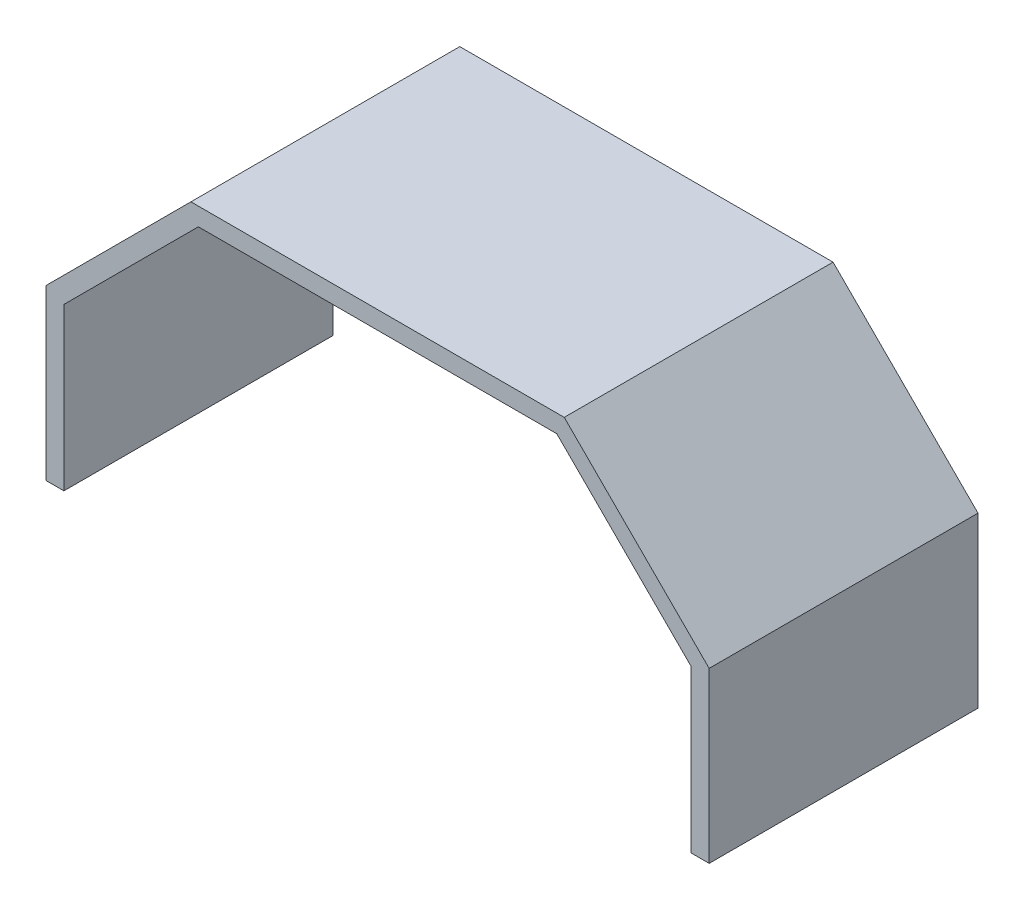
ISO-10303-21;
HEADER;
FILE_DESCRIPTION(('STEP AP214'),'2;1');
FILE_NAME('part.step','',(''),(''),'','','');
FILE_SCHEMA(('AUTOMOTIVE_DESIGN { 1 0 10303 214 1 1 1 1 }'));
ENDSEC;
DATA;
#1=APPLICATION_CONTEXT('core data for automotive mechanical design processes');
#2=APPLICATION_PROTOCOL_DEFINITION('international standard','automotive_design',2000,#1);
#3=PRODUCT_CONTEXT('',#1,'mechanical');
#4=PRODUCT('Part','Part','',(#3));
#5=PRODUCT_RELATED_PRODUCT_CATEGORY('part','',(#4));
#6=PRODUCT_DEFINITION_FORMATION('','',#4);
#7=PRODUCT_DEFINITION_CONTEXT('part definition',#1,'design');
#8=PRODUCT_DEFINITION('design','',#6,#7);
#9=PRODUCT_DEFINITION_SHAPE('','',#8);
#10=(LENGTH_UNIT() NAMED_UNIT(*) SI_UNIT(.MILLI.,.METRE.));
#11=(NAMED_UNIT(*) PLANE_ANGLE_UNIT() SI_UNIT($,.RADIAN.));
#12=(NAMED_UNIT(*) SI_UNIT($,.STERADIAN.) SOLID_ANGLE_UNIT());
#13=UNCERTAINTY_MEASURE_WITH_UNIT(LENGTH_MEASURE(1.E-05),#10,'distance_accuracy_value','');
#14=(GEOMETRIC_REPRESENTATION_CONTEXT(3) GLOBAL_UNCERTAINTY_ASSIGNED_CONTEXT((#13)) GLOBAL_UNIT_ASSIGNED_CONTEXT((#10,
#11,#12)) REPRESENTATION_CONTEXT('',''));
#15=CARTESIAN_POINT('',(0.,0.,0.));
#16=DIRECTION('',(0.,0.,1.));
#17=DIRECTION('',(1.,0.,0.));
#18=AXIS2_PLACEMENT_3D('',#15,#16,#17);
#19=CARTESIAN_POINT('',(37.,32.4152093182311,30.));
#20=DIRECTION('',(-1.,0.,0.));
#21=DIRECTION('',(0.,0.,1.));
#22=AXIS2_PLACEMENT_3D('',#19,#20,#21);
#23=PLANE('',#22);
#24=DIRECTION('',(0.,1.,0.));
#25=VECTOR('',#24,1.);
#26=CARTESIAN_POINT('',(37.,32.4152093182311,0.));
#27=LINE('',#26,#25);
#28=CARTESIAN_POINT('',(37.,13.5658743437964,0.));
#29=VERTEX_POINT('',#28);
#30=CARTESIAN_POINT('',(37.,32.4152093182311,0.));
#31=VERTEX_POINT('',#30);
#32=EDGE_CURVE('E157',#29,#31,#27,.T.);
#33=ORIENTED_EDGE('',*,*,#32,.T.);
#34=DIRECTION('',(0.,0.,-1.));
#35=VECTOR('',#34,1.);
#36=CARTESIAN_POINT('',(37.,32.4152093182311,30.));
#37=LINE('',#36,#35);
#38=CARTESIAN_POINT('',(37.,32.4152093182311,30.));
#39=VERTEX_POINT('',#38);
#40=EDGE_CURVE('E11',#39,#31,#37,.T.);
#41=ORIENTED_EDGE('',*,*,#40,.F.);
#42=DIRECTION('',(0.,1.,0.));
#43=VECTOR('',#42,1.);
#44=CARTESIAN_POINT('',(37.,32.4152093182311,30.));
#45=LINE('',#44,#43);
#46=CARTESIAN_POINT('',(37.,13.5658743437964,30.));
#47=VERTEX_POINT('',#46);
#48=EDGE_CURVE('E179',#47,#39,#45,.T.);
#49=ORIENTED_EDGE('',*,*,#48,.F.);
#50=DIRECTION('',(0.,0.,-1.));
#51=VECTOR('',#50,1.);
#52=CARTESIAN_POINT('',(37.,13.5658743437964,30.));
#53=LINE('',#52,#51);
#54=EDGE_CURVE('E153',#47,#29,#53,.T.);
#55=ORIENTED_EDGE('',*,*,#54,.T.);
#56=EDGE_LOOP('',(#33,#41,#49,#55));
#57=FACE_BOUND('',#56,.T.);
#58=ADVANCED_FACE('F37',(#57),#23,.F.);
#59=CARTESIAN_POINT('',(20.8284271247462,48.5867821934849,30.));
#60=DIRECTION('',(-0.707106781186548,-0.707106781186547,0.));
#61=DIRECTION('',(0.707106781186547,-0.707106781186548,0.));
#62=AXIS2_PLACEMENT_3D('',#59,#60,#61);
#63=PLANE('',#62);
#64=DIRECTION('',(-0.707106781186547,0.707106781186548,0.));
#65=VECTOR('',#64,1.);
#66=CARTESIAN_POINT('',(20.8284271247462,48.5867821934849,0.));
#67=LINE('',#66,#65);
#68=CARTESIAN_POINT('',(20.8284271247462,48.5867821934849,0.));
#69=VERTEX_POINT('',#68);
#70=EDGE_CURVE('E160',#31,#69,#67,.T.);
#71=ORIENTED_EDGE('',*,*,#70,.T.);
#72=DIRECTION('',(0.,0.,-1.));
#73=VECTOR('',#72,1.);
#74=CARTESIAN_POINT('',(20.8284271247462,48.5867821934849,30.));
#75=LINE('',#74,#73);
#76=CARTESIAN_POINT('',(20.8284271247462,48.5867821934849,30.));
#77=VERTEX_POINT('',#76);
#78=EDGE_CURVE('E45',#77,#69,#75,.T.);
#79=ORIENTED_EDGE('',*,*,#78,.F.);
#80=DIRECTION('',(-0.707106781186547,0.707106781186548,0.));
#81=VECTOR('',#80,1.);
#82=CARTESIAN_POINT('',(20.8284271247462,48.5867821934849,30.));
#83=LINE('',#82,#81);
#84=EDGE_CURVE('E108',#39,#77,#83,.T.);
#85=ORIENTED_EDGE('',*,*,#84,.F.);
#86=ORIENTED_EDGE('',*,*,#40,.T.);
#87=EDGE_LOOP('',(#71,#79,#85,#86));
#88=FACE_BOUND('',#87,.T.);
#89=ADVANCED_FACE('F257',(#88),#63,.F.);
#90=CARTESIAN_POINT('',(-20.8284271247462,48.5867821934849,30.));
#91=DIRECTION('',(0.,-1.,0.));
#92=DIRECTION('',(0.,0.,-1.));
#93=AXIS2_PLACEMENT_3D('',#90,#91,#92);
#94=PLANE('',#93);
#95=DIRECTION('',(-1.,0.,0.));
#96=VECTOR('',#95,1.);
#97=CARTESIAN_POINT('',(-20.8284271247462,48.5867821934849,0.));
#98=LINE('',#97,#96);
#99=CARTESIAN_POINT('',(-20.8284271247462,48.5867821934849,0.));
#100=VERTEX_POINT('',#99);
#101=EDGE_CURVE('E162',#69,#100,#98,.T.);
#102=ORIENTED_EDGE('',*,*,#101,.T.);
#103=DIRECTION('',(0.,0.,-1.));
#104=VECTOR('',#103,1.);
#105=CARTESIAN_POINT('',(-20.8284271247462,48.5867821934849,30.));
#106=LINE('',#105,#104);
#107=CARTESIAN_POINT('',(-20.8284271247462,48.5867821934849,30.));
#108=VERTEX_POINT('',#107);
#109=EDGE_CURVE('E198',#108,#100,#106,.T.);
#110=ORIENTED_EDGE('',*,*,#109,.F.);
#111=DIRECTION('',(-1.,0.,0.));
#112=VECTOR('',#111,1.);
#113=CARTESIAN_POINT('',(-20.8284271247462,48.5867821934849,30.));
#114=LINE('',#113,#112);
#115=EDGE_CURVE('E206',#77,#108,#114,.T.);
#116=ORIENTED_EDGE('',*,*,#115,.F.);
#117=ORIENTED_EDGE('',*,*,#78,.T.);
#118=EDGE_LOOP('',(#102,#110,#116,#117));
#119=FACE_BOUND('',#118,.T.);
#120=ADVANCED_FACE('F204',(#119),#94,.F.);
#121=CARTESIAN_POINT('',(-37.,32.4152093182311,30.));
#122=DIRECTION('',(0.707106781186548,-0.707106781186547,0.));
#123=DIRECTION('',(0.707106781186547,0.707106781186548,0.));
#124=AXIS2_PLACEMENT_3D('',#121,#122,#123);
#125=PLANE('',#124);
#126=DIRECTION('',(-0.707106781186547,-0.707106781186548,0.));
#127=VECTOR('',#126,1.);
#128=CARTESIAN_POINT('',(-37.,32.4152093182311,0.));
#129=LINE('',#128,#127);
#130=CARTESIAN_POINT('',(-37.,32.4152093182311,0.));
#131=VERTEX_POINT('',#130);
#132=EDGE_CURVE('E164',#100,#131,#129,.T.);
#133=ORIENTED_EDGE('',*,*,#132,.T.);
#134=DIRECTION('',(0.,0.,-1.));
#135=VECTOR('',#134,1.);
#136=CARTESIAN_POINT('',(-37.,32.4152093182311,30.));
#137=LINE('',#136,#135);
#138=CARTESIAN_POINT('',(-37.,32.4152093182311,30.));
#139=VERTEX_POINT('',#138);
#140=EDGE_CURVE('E195',#139,#131,#137,.T.);
#141=ORIENTED_EDGE('',*,*,#140,.F.);
#142=DIRECTION('',(-0.707106781186547,-0.707106781186548,0.));
#143=VECTOR('',#142,1.);
#144=CARTESIAN_POINT('',(-37.,32.4152093182311,30.));
#145=LINE('',#144,#143);
#146=EDGE_CURVE('E224',#108,#139,#145,.T.);
#147=ORIENTED_EDGE('',*,*,#146,.F.);
#148=ORIENTED_EDGE('',*,*,#109,.T.);
#149=EDGE_LOOP('',(#133,#141,#147,#148));
#150=FACE_BOUND('',#149,.T.);
#151=ADVANCED_FACE('F215',(#150),#125,.F.);
#152=CARTESIAN_POINT('',(-37.,13.5658743437964,30.));
#153=DIRECTION('',(1.,0.,0.));
#154=DIRECTION('',(0.,0.,-1.));
#155=AXIS2_PLACEMENT_3D('',#152,#153,#154);
#156=PLANE('',#155);
#157=DIRECTION('',(0.,-1.,0.));
#158=VECTOR('',#157,1.);
#159=CARTESIAN_POINT('',(-37.,13.5658743437964,0.));
#160=LINE('',#159,#158);
#161=CARTESIAN_POINT('',(-37.,13.5658743437964,0.));
#162=VERTEX_POINT('',#161);
#163=EDGE_CURVE('E166',#131,#162,#160,.T.);
#164=ORIENTED_EDGE('',*,*,#163,.T.);
#165=DIRECTION('',(0.,0.,-1.));
#166=VECTOR('',#165,1.);
#167=CARTESIAN_POINT('',(-37.,13.5658743437964,30.));
#168=LINE('',#167,#166);
#169=CARTESIAN_POINT('',(-37.,13.5658743437964,30.));
#170=VERTEX_POINT('',#169);
#171=EDGE_CURVE('E192',#170,#162,#168,.T.);
#172=ORIENTED_EDGE('',*,*,#171,.F.);
#173=DIRECTION('',(0.,-1.,0.));
#174=VECTOR('',#173,1.);
#175=CARTESIAN_POINT('',(-37.,13.5658743437964,30.));
#176=LINE('',#175,#174);
#177=EDGE_CURVE('E221',#139,#170,#176,.T.);
#178=ORIENTED_EDGE('',*,*,#177,.F.);
#179=ORIENTED_EDGE('',*,*,#140,.T.);
#180=EDGE_LOOP('',(#164,#172,#178,#179));
#181=FACE_BOUND('',#180,.T.);
#182=ADVANCED_FACE('F219',(#181),#156,.F.);
#183=CARTESIAN_POINT('',(-35.,13.5658743437964,30.));
#184=DIRECTION('',(0.,1.,0.));
#185=DIRECTION('',(0.,0.,1.));
#186=AXIS2_PLACEMENT_3D('',#183,#184,#185);
#187=PLANE('',#186);
#188=DIRECTION('',(1.,0.,0.));
#189=VECTOR('',#188,1.);
#190=CARTESIAN_POINT('',(-35.,13.5658743437964,0.));
#191=LINE('',#190,#189);
#192=CARTESIAN_POINT('',(-35.,13.5658743437964,0.));
#193=VERTEX_POINT('',#192);
#194=EDGE_CURVE('E168',#162,#193,#191,.T.);
#195=ORIENTED_EDGE('',*,*,#194,.T.);
#196=DIRECTION('',(0.,0.,-1.));
#197=VECTOR('',#196,1.);
#198=CARTESIAN_POINT('',(-35.,13.5658743437964,30.));
#199=LINE('',#198,#197);
#200=CARTESIAN_POINT('',(-35.,13.5658743437964,30.));
#201=VERTEX_POINT('',#200);
#202=EDGE_CURVE('E189',#201,#193,#199,.T.);
#203=ORIENTED_EDGE('',*,*,#202,.F.);
#204=DIRECTION('',(1.,0.,0.));
#205=VECTOR('',#204,1.);
#206=CARTESIAN_POINT('',(-35.,13.5658743437964,30.));
#207=LINE('',#206,#205);
#208=EDGE_CURVE('E223',#170,#201,#207,.T.);
#209=ORIENTED_EDGE('',*,*,#208,.F.);
#210=ORIENTED_EDGE('',*,*,#171,.T.);
#211=EDGE_LOOP('',(#195,#203,#209,#210));
#212=FACE_BOUND('',#211,.T.);
#213=ADVANCED_FACE('F270',(#212),#187,.F.);
#214=CARTESIAN_POINT('',(-35.,31.5867821934849,30.));
#215=DIRECTION('',(-1.,0.,0.));
#216=DIRECTION('',(0.,-1.,0.));
#217=AXIS2_PLACEMENT_3D('',#214,#215,#216);
#218=PLANE('',#217);
#219=DIRECTION('',(0.,1.,0.));
#220=VECTOR('',#219,1.);
#221=CARTESIAN_POINT('',(-35.,31.5867821934849,0.));
#222=LINE('',#221,#220);
#223=CARTESIAN_POINT('',(-35.,31.5867821934849,0.));
#224=VERTEX_POINT('',#223);
#225=EDGE_CURVE('E170',#193,#224,#222,.T.);
#226=ORIENTED_EDGE('',*,*,#225,.T.);
#227=DIRECTION('',(0.,0.,-1.));
#228=VECTOR('',#227,1.);
#229=CARTESIAN_POINT('',(-35.,31.5867821934849,30.));
#230=LINE('',#229,#228);
#231=CARTESIAN_POINT('',(-35.,31.5867821934849,30.));
#232=VERTEX_POINT('',#231);
#233=EDGE_CURVE('E186',#232,#224,#230,.T.);
#234=ORIENTED_EDGE('',*,*,#233,.F.);
#235=DIRECTION('',(0.,1.,0.));
#236=VECTOR('',#235,1.);
#237=CARTESIAN_POINT('',(-35.,31.5867821934849,30.));
#238=LINE('',#237,#236);
#239=EDGE_CURVE('E226',#201,#232,#238,.T.);
#240=ORIENTED_EDGE('',*,*,#239,.F.);
#241=ORIENTED_EDGE('',*,*,#202,.T.);
#242=EDGE_LOOP('',(#226,#234,#240,#241));
#243=FACE_BOUND('',#242,.T.);
#244=ADVANCED_FACE('F273',(#243),#218,.F.);
#245=CARTESIAN_POINT('',(-20.,46.5867821934849,30.));
#246=DIRECTION('',(-0.707106781186548,0.707106781186547,0.));
#247=DIRECTION('',(-0.707106781186547,-0.707106781186548,0.));
#248=AXIS2_PLACEMENT_3D('',#245,#246,#247);
#249=PLANE('',#248);
#250=DIRECTION('',(0.707106781186547,0.707106781186548,0.));
#251=VECTOR('',#250,1.);
#252=CARTESIAN_POINT('',(-20.,46.5867821934849,0.));
#253=LINE('',#252,#251);
#254=CARTESIAN_POINT('',(-20.,46.5867821934849,0.));
#255=VERTEX_POINT('',#254);
#256=EDGE_CURVE('E172',#224,#255,#253,.T.);
#257=ORIENTED_EDGE('',*,*,#256,.T.);
#258=DIRECTION('',(0.,0.,-1.));
#259=VECTOR('',#258,1.);
#260=CARTESIAN_POINT('',(-20.,46.5867821934849,30.));
#261=LINE('',#260,#259);
#262=CARTESIAN_POINT('',(-20.,46.5867821934849,30.));
#263=VERTEX_POINT('',#262);
#264=EDGE_CURVE('E183',#263,#255,#261,.T.);
#265=ORIENTED_EDGE('',*,*,#264,.F.);
#266=DIRECTION('',(0.707106781186547,0.707106781186548,0.));
#267=VECTOR('',#266,1.);
#268=CARTESIAN_POINT('',(-20.,46.5867821934849,30.));
#269=LINE('',#268,#267);
#270=EDGE_CURVE('E232',#232,#263,#269,.T.);
#271=ORIENTED_EDGE('',*,*,#270,.F.);
#272=ORIENTED_EDGE('',*,*,#233,.T.);
#273=EDGE_LOOP('',(#257,#265,#271,#272));
#274=FACE_BOUND('',#273,.T.);
#275=ADVANCED_FACE('F238',(#274),#249,.F.);
#276=CARTESIAN_POINT('',(20.,46.5867821934849,30.));
#277=DIRECTION('',(0.,1.,0.));
#278=DIRECTION('',(-1.,0.,0.));
#279=AXIS2_PLACEMENT_3D('',#276,#277,#278);
#280=PLANE('',#279);
#281=DIRECTION('',(1.,0.,0.));
#282=VECTOR('',#281,1.);
#283=CARTESIAN_POINT('',(20.,46.5867821934849,0.));
#284=LINE('',#283,#282);
#285=CARTESIAN_POINT('',(20.,46.5867821934849,0.));
#286=VERTEX_POINT('',#285);
#287=EDGE_CURVE('E174',#255,#286,#284,.T.);
#288=ORIENTED_EDGE('',*,*,#287,.T.);
#289=DIRECTION('',(0.,0.,-1.));
#290=VECTOR('',#289,1.);
#291=CARTESIAN_POINT('',(20.,46.5867821934849,30.));
#292=LINE('',#291,#290);
#293=CARTESIAN_POINT('',(20.,46.5867821934849,30.));
#294=VERTEX_POINT('',#293);
#295=EDGE_CURVE('E148',#294,#286,#292,.T.);
#296=ORIENTED_EDGE('',*,*,#295,.F.);
#297=DIRECTION('',(1.,0.,0.));
#298=VECTOR('',#297,1.);
#299=CARTESIAN_POINT('',(20.,46.5867821934849,30.));
#300=LINE('',#299,#298);
#301=EDGE_CURVE('E139',#263,#294,#300,.T.);
#302=ORIENTED_EDGE('',*,*,#301,.F.);
#303=ORIENTED_EDGE('',*,*,#264,.T.);
#304=EDGE_LOOP('',(#288,#296,#302,#303));
#305=FACE_BOUND('',#304,.T.);
#306=ADVANCED_FACE('F242',(#305),#280,.F.);
#307=CARTESIAN_POINT('',(35.,31.5867821934849,30.));
#308=DIRECTION('',(0.707106781186548,0.707106781186547,0.));
#309=DIRECTION('',(-0.707106781186547,0.707106781186548,0.));
#310=AXIS2_PLACEMENT_3D('',#307,#308,#309);
#311=PLANE('',#310);
#312=DIRECTION('',(0.707106781186547,-0.707106781186548,0.));
#313=VECTOR('',#312,1.);
#314=CARTESIAN_POINT('',(35.,31.5867821934849,0.));
#315=LINE('',#314,#313);
#316=CARTESIAN_POINT('',(35.,31.5867821934849,0.));
#317=VERTEX_POINT('',#316);
#318=EDGE_CURVE('E147',#286,#317,#315,.T.);
#319=ORIENTED_EDGE('',*,*,#318,.T.);
#320=DIRECTION('',(0.,0.,-1.));
#321=VECTOR('',#320,1.);
#322=CARTESIAN_POINT('',(35.,31.5867821934849,30.));
#323=LINE('',#322,#321);
#324=CARTESIAN_POINT('',(35.,31.5867821934849,30.));
#325=VERTEX_POINT('',#324);
#326=EDGE_CURVE('E144',#325,#317,#323,.T.);
#327=ORIENTED_EDGE('',*,*,#326,.F.);
#328=DIRECTION('',(0.707106781186547,-0.707106781186548,0.));
#329=VECTOR('',#328,1.);
#330=CARTESIAN_POINT('',(35.,31.5867821934849,30.));
#331=LINE('',#330,#329);
#332=EDGE_CURVE('E133',#294,#325,#331,.T.);
#333=ORIENTED_EDGE('',*,*,#332,.F.);
#334=ORIENTED_EDGE('',*,*,#295,.T.);
#335=EDGE_LOOP('',(#319,#327,#333,#334));
#336=FACE_BOUND('',#335,.T.);
#337=ADVANCED_FACE('F145',(#336),#311,.F.);
#338=CARTESIAN_POINT('',(35.,13.5658743437964,30.));
#339=DIRECTION('',(1.,0.,0.));
#340=DIRECTION('',(0.,0.,-1.));
#341=AXIS2_PLACEMENT_3D('',#338,#339,#340);
#342=PLANE('',#341);
#343=DIRECTION('',(0.,-1.,0.));
#344=VECTOR('',#343,1.);
#345=CARTESIAN_POINT('',(35.,13.5658743437964,0.));
#346=LINE('',#345,#344);
#347=CARTESIAN_POINT('',(35.,13.5658743437964,0.));
#348=VERTEX_POINT('',#347);
#349=EDGE_CURVE('E94',#317,#348,#346,.T.);
#350=ORIENTED_EDGE('',*,*,#349,.T.);
#351=DIRECTION('',(0.,0.,-1.));
#352=VECTOR('',#351,1.);
#353=CARTESIAN_POINT('',(35.,13.5658743437964,30.));
#354=LINE('',#353,#352);
#355=CARTESIAN_POINT('',(35.,13.5658743437964,30.));
#356=VERTEX_POINT('',#355);
#357=EDGE_CURVE('E149',#356,#348,#354,.T.);
#358=ORIENTED_EDGE('',*,*,#357,.F.);
#359=DIRECTION('',(0.,-1.,0.));
#360=VECTOR('',#359,1.);
#361=CARTESIAN_POINT('',(35.,13.5658743437964,30.));
#362=LINE('',#361,#360);
#363=EDGE_CURVE('E137',#325,#356,#362,.T.);
#364=ORIENTED_EDGE('',*,*,#363,.F.);
#365=ORIENTED_EDGE('',*,*,#326,.T.);
#366=EDGE_LOOP('',(#350,#358,#364,#365));
#367=FACE_BOUND('',#366,.T.);
#368=ADVANCED_FACE('F151',(#367),#342,.F.);
#369=CARTESIAN_POINT('',(37.,13.5658743437964,30.));
#370=DIRECTION('',(0.,1.,0.));
#371=DIRECTION('',(-1.,0.,0.));
#372=AXIS2_PLACEMENT_3D('',#369,#370,#371);
#373=PLANE('',#372);
#374=DIRECTION('',(1.,0.,0.));
#375=VECTOR('',#374,1.);
#376=CARTESIAN_POINT('',(37.,13.5658743437964,0.));
#377=LINE('',#376,#375);
#378=EDGE_CURVE('E100',#348,#29,#377,.T.);
#379=ORIENTED_EDGE('',*,*,#378,.T.);
#380=ORIENTED_EDGE('',*,*,#54,.F.);
#381=DIRECTION('',(1.,0.,0.));
#382=VECTOR('',#381,1.);
#383=CARTESIAN_POINT('',(37.,13.5658743437964,30.));
#384=LINE('',#383,#382);
#385=EDGE_CURVE('E53',#356,#47,#384,.T.);
#386=ORIENTED_EDGE('',*,*,#385,.F.);
#387=ORIENTED_EDGE('',*,*,#357,.T.);
#388=EDGE_LOOP('',(#379,#380,#386,#387));
#389=FACE_BOUND('',#388,.T.);
#390=ADVANCED_FACE('F246',(#389),#373,.F.);
#391=CARTESIAN_POINT('',(0.,0.,30.));
#392=DIRECTION('',(0.,0.,-1.));
#393=DIRECTION('',(-1.,0.,0.));
#394=AXIS2_PLACEMENT_3D('',#391,#392,#393);
#395=PLANE('',#394);
#396=ORIENTED_EDGE('',*,*,#48,.T.);
#397=ORIENTED_EDGE('',*,*,#84,.T.);
#398=ORIENTED_EDGE('',*,*,#115,.T.);
#399=ORIENTED_EDGE('',*,*,#146,.T.);
#400=ORIENTED_EDGE('',*,*,#177,.T.);
#401=ORIENTED_EDGE('',*,*,#208,.T.);
#402=ORIENTED_EDGE('',*,*,#239,.T.);
#403=ORIENTED_EDGE('',*,*,#270,.T.);
#404=ORIENTED_EDGE('',*,*,#301,.T.);
#405=ORIENTED_EDGE('',*,*,#332,.T.);
#406=ORIENTED_EDGE('',*,*,#363,.T.);
#407=ORIENTED_EDGE('',*,*,#385,.T.);
#408=EDGE_LOOP('',(#396,#397,#398,#399,#400,#401,#402,#403,#404,#405,#406,#407));
#409=FACE_BOUND('',#408,.T.);
#410=ADVANCED_FACE('F135',(#409),#395,.F.);
#411=CARTESIAN_POINT('',(0.,0.,0.));
#412=DIRECTION('',(0.,0.,-1.));
#413=DIRECTION('',(-1.,0.,0.));
#414=AXIS2_PLACEMENT_3D('',#411,#412,#413);
#415=PLANE('',#414);
#416=ORIENTED_EDGE('',*,*,#32,.F.);
#417=ORIENTED_EDGE('',*,*,#378,.F.);
#418=ORIENTED_EDGE('',*,*,#349,.F.);
#419=ORIENTED_EDGE('',*,*,#318,.F.);
#420=ORIENTED_EDGE('',*,*,#287,.F.);
#421=ORIENTED_EDGE('',*,*,#256,.F.);
#422=ORIENTED_EDGE('',*,*,#225,.F.);
#423=ORIENTED_EDGE('',*,*,#194,.F.);
#424=ORIENTED_EDGE('',*,*,#163,.F.);
#425=ORIENTED_EDGE('',*,*,#132,.F.);
#426=ORIENTED_EDGE('',*,*,#101,.F.);
#427=ORIENTED_EDGE('',*,*,#70,.F.);
#428=EDGE_LOOP('',(#416,#417,#418,#419,#420,#421,#422,#423,#424,#425,#426,#427));
#429=FACE_BOUND('',#428,.T.);
#430=ADVANCED_FACE('F210',(#429),#415,.T.);
#431=CLOSED_SHELL('',(#58,#89,#120,#151,#182,#213,#244,#275,#306,#337,#368,#390,#410,#430));
#432=MANIFOLD_SOLID_BREP('B2',#431);
#433=ADVANCED_BREP_SHAPE_REPRESENTATION('',(#18,#432),#14);
#434=SHAPE_DEFINITION_REPRESENTATION(#9,#433);
ENDSEC;
END-ISO-10303-21;
